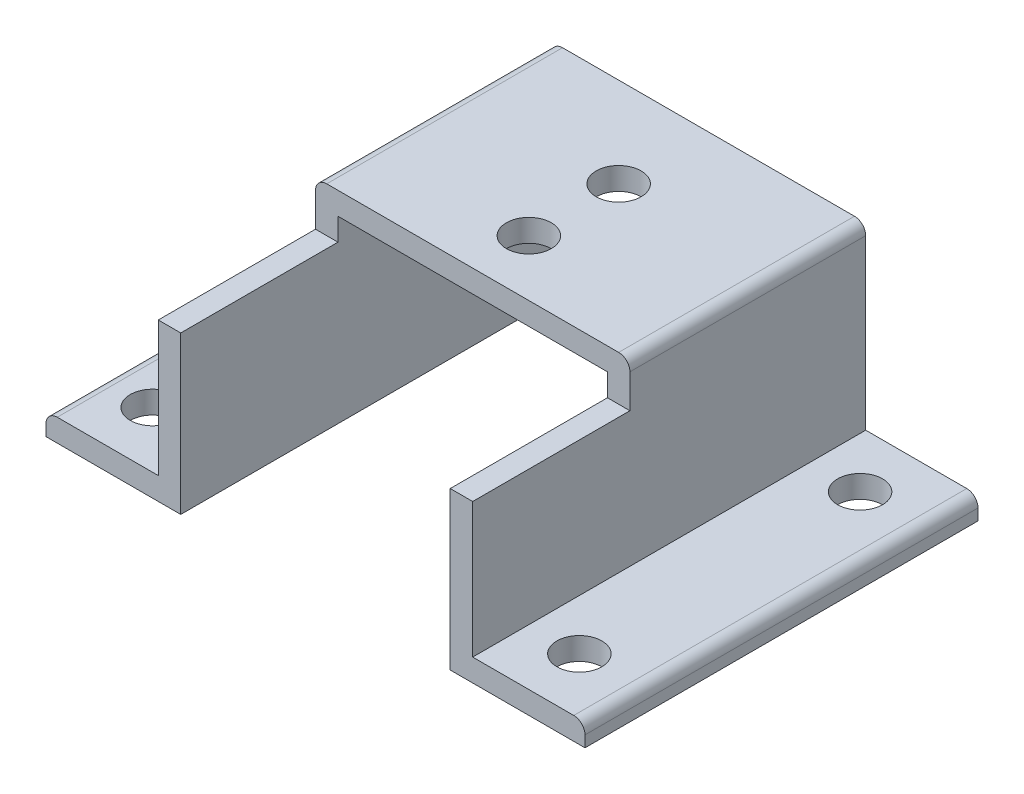
ISO-10303-21;
HEADER;
FILE_DESCRIPTION(('STEP AP214'),'2;1');
FILE_NAME('part.step','',(''),(''),'','','');
FILE_SCHEMA(('AUTOMOTIVE_DESIGN { 1 0 10303 214 1 1 1 1 }'));
ENDSEC;
DATA;
#1=APPLICATION_CONTEXT('core data for automotive mechanical design processes');
#2=APPLICATION_PROTOCOL_DEFINITION('international standard','automotive_design',2000,#1);
#3=PRODUCT_CONTEXT('',#1,'mechanical');
#4=PRODUCT('Part','Part','',(#3));
#5=PRODUCT_RELATED_PRODUCT_CATEGORY('part','',(#4));
#6=PRODUCT_DEFINITION_FORMATION('','',#4);
#7=PRODUCT_DEFINITION_CONTEXT('part definition',#1,'design');
#8=PRODUCT_DEFINITION('design','',#6,#7);
#9=PRODUCT_DEFINITION_SHAPE('','',#8);
#10=(LENGTH_UNIT() NAMED_UNIT(*) SI_UNIT(.MILLI.,.METRE.));
#11=(NAMED_UNIT(*) PLANE_ANGLE_UNIT() SI_UNIT($,.RADIAN.));
#12=(NAMED_UNIT(*) SI_UNIT($,.STERADIAN.) SOLID_ANGLE_UNIT());
#13=UNCERTAINTY_MEASURE_WITH_UNIT(LENGTH_MEASURE(1.E-05),#10,'distance_accuracy_value','');
#14=(GEOMETRIC_REPRESENTATION_CONTEXT(3) GLOBAL_UNCERTAINTY_ASSIGNED_CONTEXT((#13)) GLOBAL_UNIT_ASSIGNED_CONTEXT((#10,
#11,#12)) REPRESENTATION_CONTEXT('',''));
#15=CARTESIAN_POINT('',(0.,0.,0.));
#16=DIRECTION('',(0.,0.,1.));
#17=DIRECTION('',(1.,0.,0.));
#18=AXIS2_PLACEMENT_3D('',#15,#16,#17);
#19=CARTESIAN_POINT('',(0.,0.,35.));
#20=DIRECTION('',(0.,0.,-1.));
#21=DIRECTION('',(-1.,0.,0.));
#22=AXIS2_PLACEMENT_3D('',#19,#20,#21);
#23=PLANE('',#22);
#24=DIRECTION('',(0.,1.,0.));
#25=VECTOR('',#24,1.);
#26=CARTESIAN_POINT('',(48.,2.,35.));
#27=LINE('',#26,#25);
#28=CARTESIAN_POINT('',(48.,0.,35.));
#29=VERTEX_POINT('',#28);
#30=CARTESIAN_POINT('',(48.,1.,35.));
#31=VERTEX_POINT('',#30);
#32=EDGE_CURVE('E224',#29,#31,#27,.T.);
#33=ORIENTED_EDGE('',*,*,#32,.T.);
#34=CARTESIAN_POINT('',(47.,1.,35.));
#35=DIRECTION('',(0.,0.,-1.));
#36=DIRECTION('',(-1.,0.,0.));
#37=AXIS2_PLACEMENT_3D('',#34,#35,#36);
#38=CIRCLE('',#37,1.);
#39=CARTESIAN_POINT('',(47.,2.,35.));
#40=VERTEX_POINT('',#39);
#41=EDGE_CURVE('E324',#31,#40,#38,.F.);
#42=ORIENTED_EDGE('',*,*,#41,.T.);
#43=DIRECTION('',(-1.,0.,0.));
#44=VECTOR('',#43,1.);
#45=CARTESIAN_POINT('',(38.,2.,35.));
#46=LINE('',#45,#44);
#47=CARTESIAN_POINT('',(38.,2.,35.));
#48=VERTEX_POINT('',#47);
#49=EDGE_CURVE('E215',#40,#48,#46,.T.);
#50=ORIENTED_EDGE('',*,*,#49,.T.);
#51=DIRECTION('',(0.,1.,0.));
#52=VECTOR('',#51,1.);
#53=CARTESIAN_POINT('',(38.,18.,35.));
#54=LINE('',#53,#52);
#55=CARTESIAN_POINT('',(38.,14.,35.));
#56=VERTEX_POINT('',#55);
#57=EDGE_CURVE('E207',#48,#56,#54,.T.);
#58=ORIENTED_EDGE('',*,*,#57,.T.);
#59=DIRECTION('',(-1.,0.,0.));
#60=VECTOR('',#59,1.);
#61=CARTESIAN_POINT('',(0.,14.,35.));
#62=LINE('',#61,#60);
#63=CARTESIAN_POINT('',(36.,14.,35.));
#64=VERTEX_POINT('',#63);
#65=EDGE_CURVE('E189',#56,#64,#62,.T.);
#66=ORIENTED_EDGE('',*,*,#65,.T.);
#67=DIRECTION('',(0.,-1.,0.));
#68=VECTOR('',#67,1.);
#69=CARTESIAN_POINT('',(36.,0.,35.));
#70=LINE('',#69,#68);
#71=CARTESIAN_POINT('',(36.,0.,35.));
#72=VERTEX_POINT('',#71);
#73=EDGE_CURVE('E417',#64,#72,#70,.T.);
#74=ORIENTED_EDGE('',*,*,#73,.T.);
#75=DIRECTION('',(1.,0.,0.));
#76=VECTOR('',#75,1.);
#77=CARTESIAN_POINT('',(48.,0.,35.));
#78=LINE('',#77,#76);
#79=EDGE_CURVE('E420',#72,#29,#78,.T.);
#80=ORIENTED_EDGE('',*,*,#79,.T.);
#81=EDGE_LOOP('',(#33,#42,#50,#58,#66,#74,#80));
#82=FACE_BOUND('',#81,.T.);
#83=ADVANCED_FACE('F46',(#82),#23,.F.);
#84=CARTESIAN_POINT('',(12.,0.,35.));
#85=DIRECTION('',(0.,1.,0.));
#86=DIRECTION('',(0.,0.,1.));
#87=AXIS2_PLACEMENT_3D('',#84,#85,#86);
#88=PLANE('',#87);
#89=CARTESIAN_POINT('',(4.5,0.,5.));
#90=DIRECTION('',(0.,1.,0.));
#91=DIRECTION('',(0.,0.,1.));
#92=AXIS2_PLACEMENT_3D('',#89,#90,#91);
#93=CIRCLE('',#92,2.);
#94=CARTESIAN_POINT('',(4.5,0.,7.));
#95=VERTEX_POINT('',#94);
#96=EDGE_CURVE('E857',#95,#95,#93,.T.);
#97=ORIENTED_EDGE('',*,*,#96,.T.);
#98=EDGE_LOOP('',(#97));
#99=FACE_BOUND('',#98,.T.);
#100=CARTESIAN_POINT('',(4.5,0.,30.));
#101=DIRECTION('',(0.,1.,0.));
#102=DIRECTION('',(0.,0.,1.));
#103=AXIS2_PLACEMENT_3D('',#100,#101,#102);
#104=CIRCLE('',#103,2.);
#105=CARTESIAN_POINT('',(4.5,0.,32.));
#106=VERTEX_POINT('',#105);
#107=EDGE_CURVE('E865',#106,#106,#104,.T.);
#108=ORIENTED_EDGE('',*,*,#107,.T.);
#109=EDGE_LOOP('',(#108));
#110=FACE_BOUND('',#109,.T.);
#111=DIRECTION('',(1.,0.,0.));
#112=VECTOR('',#111,1.);
#113=CARTESIAN_POINT('',(12.,0.,0.));
#114=LINE('',#113,#112);
#115=CARTESIAN_POINT('',(0.,0.,0.));
#116=VERTEX_POINT('',#115);
#117=CARTESIAN_POINT('',(12.,0.,0.));
#118=VERTEX_POINT('',#117);
#119=EDGE_CURVE('E235',#116,#118,#114,.T.);
#120=ORIENTED_EDGE('',*,*,#119,.T.);
#121=DIRECTION('',(0.,0.,-1.));
#122=VECTOR('',#121,1.);
#123=CARTESIAN_POINT('',(12.,0.,35.));
#124=LINE('',#123,#122);
#125=CARTESIAN_POINT('',(12.,0.,35.));
#126=VERTEX_POINT('',#125);
#127=EDGE_CURVE('E202',#126,#118,#124,.T.);
#128=ORIENTED_EDGE('',*,*,#127,.F.);
#129=DIRECTION('',(1.,0.,0.));
#130=VECTOR('',#129,1.);
#131=CARTESIAN_POINT('',(12.,0.,35.));
#132=LINE('',#131,#130);
#133=CARTESIAN_POINT('',(0.,0.,35.));
#134=VERTEX_POINT('',#133);
#135=EDGE_CURVE('E278',#134,#126,#132,.T.);
#136=ORIENTED_EDGE('',*,*,#135,.F.);
#137=DIRECTION('',(0.,0.,-1.));
#138=VECTOR('',#137,1.);
#139=CARTESIAN_POINT('',(0.,0.,35.));
#140=LINE('',#139,#138);
#141=EDGE_CURVE('E234',#134,#116,#140,.T.);
#142=ORIENTED_EDGE('',*,*,#141,.T.);
#143=EDGE_LOOP('',(#120,#128,#136,#142));
#144=FACE_BOUND('',#143,.T.);
#145=ADVANCED_FACE('F476',(#99,#110,#144),#88,.F.);
#146=CARTESIAN_POINT('',(12.,16.,35.));
#147=DIRECTION('',(-1.,0.,0.));
#148=DIRECTION('',(0.,0.,1.));
#149=AXIS2_PLACEMENT_3D('',#146,#147,#148);
#150=PLANE('',#149);
#151=DIRECTION('',(0.,0.,-1.));
#152=VECTOR('',#151,1.);
#153=CARTESIAN_POINT('',(12.,16.,35.));
#154=LINE('',#153,#152);
#155=CARTESIAN_POINT('',(12.,16.,21.));
#156=VERTEX_POINT('',#155);
#157=CARTESIAN_POINT('',(12.,16.,0.));
#158=VERTEX_POINT('',#157);
#159=EDGE_CURVE('E300',#156,#158,#154,.T.);
#160=ORIENTED_EDGE('',*,*,#159,.F.);
#161=DIRECTION('',(0.,-1.,0.));
#162=VECTOR('',#161,1.);
#163=CARTESIAN_POINT('',(12.,16.,21.));
#164=LINE('',#163,#162);
#165=CARTESIAN_POINT('',(12.,14.,21.));
#166=VERTEX_POINT('',#165);
#167=EDGE_CURVE('E240',#156,#166,#164,.T.);
#168=ORIENTED_EDGE('',*,*,#167,.T.);
#169=DIRECTION('',(0.,0.,1.));
#170=VECTOR('',#169,1.);
#171=CARTESIAN_POINT('',(12.,14.,35.));
#172=LINE('',#171,#170);
#173=CARTESIAN_POINT('',(12.,14.,35.));
#174=VERTEX_POINT('',#173);
#175=EDGE_CURVE('E395',#166,#174,#172,.T.);
#176=ORIENTED_EDGE('',*,*,#175,.T.);
#177=DIRECTION('',(0.,1.,0.));
#178=VECTOR('',#177,1.);
#179=CARTESIAN_POINT('',(12.,16.,35.));
#180=LINE('',#179,#178);
#181=EDGE_CURVE('E413',#126,#174,#180,.T.);
#182=ORIENTED_EDGE('',*,*,#181,.F.);
#183=ORIENTED_EDGE('',*,*,#127,.T.);
#184=DIRECTION('',(0.,1.,0.));
#185=VECTOR('',#184,1.);
#186=CARTESIAN_POINT('',(12.,16.,0.));
#187=LINE('',#186,#185);
#188=EDGE_CURVE('E239',#118,#158,#187,.T.);
#189=ORIENTED_EDGE('',*,*,#188,.T.);
#190=EDGE_LOOP('',(#160,#168,#176,#182,#183,#189));
#191=FACE_BOUND('',#190,.T.);
#192=ADVANCED_FACE('F481',(#191),#150,.F.);
#193=CARTESIAN_POINT('',(36.,16.,35.));
#194=DIRECTION('',(0.,1.,0.));
#195=DIRECTION('',(0.,0.,1.));
#196=AXIS2_PLACEMENT_3D('',#193,#194,#195);
#197=PLANE('',#196);
#198=CARTESIAN_POINT('',(24.,16.,16.));
#199=DIRECTION('',(0.,1.,0.));
#200=DIRECTION('',(0.,0.,1.));
#201=AXIS2_PLACEMENT_3D('',#198,#199,#200);
#202=CIRCLE('',#201,2.);
#203=CARTESIAN_POINT('',(24.,16.,18.));
#204=VERTEX_POINT('',#203);
#205=EDGE_CURVE('E362',#204,#204,#202,.T.);
#206=ORIENTED_EDGE('',*,*,#205,.T.);
#207=EDGE_LOOP('',(#206));
#208=FACE_BOUND('',#207,.T.);
#209=CARTESIAN_POINT('',(24.,16.,8.));
#210=DIRECTION('',(0.,1.,0.));
#211=DIRECTION('',(0.,0.,1.));
#212=AXIS2_PLACEMENT_3D('',#209,#210,#211);
#213=CIRCLE('',#212,2.);
#214=CARTESIAN_POINT('',(24.,16.,10.));
#215=VERTEX_POINT('',#214);
#216=EDGE_CURVE('E358',#215,#215,#213,.T.);
#217=ORIENTED_EDGE('',*,*,#216,.T.);
#218=EDGE_LOOP('',(#217));
#219=FACE_BOUND('',#218,.T.);
#220=DIRECTION('',(0.,0.,-1.));
#221=VECTOR('',#220,1.);
#222=CARTESIAN_POINT('',(36.,16.,35.));
#223=LINE('',#222,#221);
#224=CARTESIAN_POINT('',(36.,16.,21.));
#225=VERTEX_POINT('',#224);
#226=CARTESIAN_POINT('',(36.,16.,0.));
#227=VERTEX_POINT('',#226);
#228=EDGE_CURVE('E297',#225,#227,#223,.T.);
#229=ORIENTED_EDGE('',*,*,#228,.F.);
#230=DIRECTION('',(-1.,0.,0.));
#231=VECTOR('',#230,1.);
#232=CARTESIAN_POINT('',(36.,16.,21.));
#233=LINE('',#232,#231);
#234=EDGE_CURVE('E403',#225,#156,#233,.T.);
#235=ORIENTED_EDGE('',*,*,#234,.T.);
#236=ORIENTED_EDGE('',*,*,#159,.T.);
#237=DIRECTION('',(1.,0.,0.));
#238=VECTOR('',#237,1.);
#239=CARTESIAN_POINT('',(36.,16.,0.));
#240=LINE('',#239,#238);
#241=EDGE_CURVE('E244',#158,#227,#240,.T.);
#242=ORIENTED_EDGE('',*,*,#241,.T.);
#243=EDGE_LOOP('',(#229,#235,#236,#242));
#244=FACE_BOUND('',#243,.T.);
#245=ADVANCED_FACE('F488',(#208,#219,#244),#197,.F.);
#246=CARTESIAN_POINT('',(36.,0.,35.));
#247=DIRECTION('',(1.,0.,0.));
#248=DIRECTION('',(0.,0.,-1.));
#249=AXIS2_PLACEMENT_3D('',#246,#247,#248);
#250=PLANE('',#249);
#251=DIRECTION('',(0.,0.,-1.));
#252=VECTOR('',#251,1.);
#253=CARTESIAN_POINT('',(36.,14.,35.));
#254=LINE('',#253,#252);
#255=CARTESIAN_POINT('',(36.,14.,21.));
#256=VERTEX_POINT('',#255);
#257=EDGE_CURVE('E196',#64,#256,#254,.T.);
#258=ORIENTED_EDGE('',*,*,#257,.T.);
#259=DIRECTION('',(0.,1.,0.));
#260=VECTOR('',#259,1.);
#261=CARTESIAN_POINT('',(36.,0.,21.));
#262=LINE('',#261,#260);
#263=EDGE_CURVE('E399',#256,#225,#262,.T.);
#264=ORIENTED_EDGE('',*,*,#263,.T.);
#265=ORIENTED_EDGE('',*,*,#228,.T.);
#266=DIRECTION('',(0.,-1.,0.));
#267=VECTOR('',#266,1.);
#268=CARTESIAN_POINT('',(36.,0.,0.));
#269=LINE('',#268,#267);
#270=CARTESIAN_POINT('',(36.,0.,0.));
#271=VERTEX_POINT('',#270);
#272=EDGE_CURVE('E248',#227,#271,#269,.T.);
#273=ORIENTED_EDGE('',*,*,#272,.T.);
#274=DIRECTION('',(0.,0.,-1.));
#275=VECTOR('',#274,1.);
#276=CARTESIAN_POINT('',(36.,0.,35.));
#277=LINE('',#276,#275);
#278=EDGE_CURVE('E293',#72,#271,#277,.T.);
#279=ORIENTED_EDGE('',*,*,#278,.F.);
#280=ORIENTED_EDGE('',*,*,#73,.F.);
#281=EDGE_LOOP('',(#258,#264,#265,#273,#279,#280));
#282=FACE_BOUND('',#281,.T.);
#283=ADVANCED_FACE('F494',(#282),#250,.F.);
#284=CARTESIAN_POINT('',(48.,0.,35.));
#285=DIRECTION('',(0.,1.,0.));
#286=DIRECTION('',(-1.,0.,0.));
#287=AXIS2_PLACEMENT_3D('',#284,#285,#286);
#288=PLANE('',#287);
#289=CARTESIAN_POINT('',(42.5,0.,30.));
#290=DIRECTION('',(0.,1.,0.));
#291=DIRECTION('',(0.,0.,1.));
#292=AXIS2_PLACEMENT_3D('',#289,#290,#291);
#293=CIRCLE('',#292,2.);
#294=CARTESIAN_POINT('',(42.5,0.,32.));
#295=VERTEX_POINT('',#294);
#296=EDGE_CURVE('E853',#295,#295,#293,.T.);
#297=ORIENTED_EDGE('',*,*,#296,.T.);
#298=EDGE_LOOP('',(#297));
#299=FACE_BOUND('',#298,.T.);
#300=CARTESIAN_POINT('',(42.5,0.,5.));
#301=DIRECTION('',(0.,1.,0.));
#302=DIRECTION('',(0.,0.,1.));
#303=AXIS2_PLACEMENT_3D('',#300,#301,#302);
#304=CIRCLE('',#303,2.);
#305=CARTESIAN_POINT('',(42.5,0.,7.));
#306=VERTEX_POINT('',#305);
#307=EDGE_CURVE('E856',#306,#306,#304,.T.);
#308=ORIENTED_EDGE('',*,*,#307,.T.);
#309=EDGE_LOOP('',(#308));
#310=FACE_BOUND('',#309,.T.);
#311=DIRECTION('',(1.,0.,0.));
#312=VECTOR('',#311,1.);
#313=CARTESIAN_POINT('',(48.,0.,0.));
#314=LINE('',#313,#312);
#315=CARTESIAN_POINT('',(48.,0.,0.));
#316=VERTEX_POINT('',#315);
#317=EDGE_CURVE('E251',#271,#316,#314,.T.);
#318=ORIENTED_EDGE('',*,*,#317,.T.);
#319=DIRECTION('',(0.,0.,-1.));
#320=VECTOR('',#319,1.);
#321=CARTESIAN_POINT('',(48.,0.,35.));
#322=LINE('',#321,#320);
#323=EDGE_CURVE('E289',#29,#316,#322,.T.);
#324=ORIENTED_EDGE('',*,*,#323,.F.);
#325=ORIENTED_EDGE('',*,*,#79,.F.);
#326=ORIENTED_EDGE('',*,*,#278,.T.);
#327=EDGE_LOOP('',(#318,#324,#325,#326));
#328=FACE_BOUND('',#327,.T.);
#329=ADVANCED_FACE('F496',(#299,#310,#328),#288,.F.);
#330=CARTESIAN_POINT('',(48.,2.,35.));
#331=DIRECTION('',(-1.,0.,0.));
#332=DIRECTION('',(0.,0.,1.));
#333=AXIS2_PLACEMENT_3D('',#330,#331,#332);
#334=PLANE('',#333);
#335=DIRECTION('',(0.,1.,0.));
#336=VECTOR('',#335,1.);
#337=CARTESIAN_POINT('',(48.,2.,0.));
#338=LINE('',#337,#336);
#339=CARTESIAN_POINT('',(48.,1.,0.));
#340=VERTEX_POINT('',#339);
#341=EDGE_CURVE('E254',#316,#340,#338,.T.);
#342=ORIENTED_EDGE('',*,*,#341,.T.);
#343=DIRECTION('',(0.,0.,-1.));
#344=VECTOR('',#343,1.);
#345=CARTESIAN_POINT('',(48.,1.,35.));
#346=LINE('',#345,#344);
#347=EDGE_CURVE('E321',#340,#31,#346,.F.);
#348=ORIENTED_EDGE('',*,*,#347,.T.);
#349=ORIENTED_EDGE('',*,*,#32,.F.);
#350=ORIENTED_EDGE('',*,*,#323,.T.);
#351=EDGE_LOOP('',(#342,#348,#349,#350));
#352=FACE_BOUND('',#351,.T.);
#353=ADVANCED_FACE('F497',(#352),#334,.F.);
#354=CARTESIAN_POINT('',(38.,2.,35.));
#355=DIRECTION('',(0.,-1.,0.));
#356=DIRECTION('',(1.,0.,0.));
#357=AXIS2_PLACEMENT_3D('',#354,#355,#356);
#358=PLANE('',#357);
#359=CARTESIAN_POINT('',(42.5,2.,30.));
#360=DIRECTION('',(0.,-1.,0.));
#361=DIRECTION('',(1.,0.,0.));
#362=AXIS2_PLACEMENT_3D('',#359,#360,#361);
#363=CIRCLE('',#362,2.);
#364=CARTESIAN_POINT('',(44.5,2.,30.));
#365=VERTEX_POINT('',#364);
#366=EDGE_CURVE('E50',#365,#365,#363,.T.);
#367=ORIENTED_EDGE('',*,*,#366,.T.);
#368=EDGE_LOOP('',(#367));
#369=FACE_BOUND('',#368,.T.);
#370=CARTESIAN_POINT('',(42.5,2.,5.));
#371=DIRECTION('',(0.,-1.,0.));
#372=DIRECTION('',(1.,0.,0.));
#373=AXIS2_PLACEMENT_3D('',#370,#371,#372);
#374=CIRCLE('',#373,2.);
#375=CARTESIAN_POINT('',(44.5,2.,5.));
#376=VERTEX_POINT('',#375);
#377=EDGE_CURVE('E359',#376,#376,#374,.T.);
#378=ORIENTED_EDGE('',*,*,#377,.T.);
#379=EDGE_LOOP('',(#378));
#380=FACE_BOUND('',#379,.T.);
#381=ORIENTED_EDGE('',*,*,#49,.F.);
#382=DIRECTION('',(0.,0.,-1.));
#383=VECTOR('',#382,1.);
#384=CARTESIAN_POINT('',(47.,2.,35.));
#385=LINE('',#384,#383);
#386=CARTESIAN_POINT('',(47.,2.,0.));
#387=VERTEX_POINT('',#386);
#388=EDGE_CURVE('E201',#40,#387,#385,.T.);
#389=ORIENTED_EDGE('',*,*,#388,.T.);
#390=DIRECTION('',(-1.,0.,0.));
#391=VECTOR('',#390,1.);
#392=CARTESIAN_POINT('',(38.,2.,0.));
#393=LINE('',#392,#391);
#394=CARTESIAN_POINT('',(38.,2.,0.));
#395=VERTEX_POINT('',#394);
#396=EDGE_CURVE('E258',#387,#395,#393,.T.);
#397=ORIENTED_EDGE('',*,*,#396,.T.);
#398=DIRECTION('',(0.,0.,-1.));
#399=VECTOR('',#398,1.);
#400=CARTESIAN_POINT('',(38.,2.,35.));
#401=LINE('',#400,#399);
#402=EDGE_CURVE('E286',#48,#395,#401,.T.);
#403=ORIENTED_EDGE('',*,*,#402,.F.);
#404=EDGE_LOOP('',(#381,#389,#397,#403));
#405=FACE_BOUND('',#404,.T.);
#406=ADVANCED_FACE('F434',(#369,#380,#405),#358,.F.);
#407=CARTESIAN_POINT('',(38.,18.,35.));
#408=DIRECTION('',(-1.,0.,0.));
#409=DIRECTION('',(0.,0.,1.));
#410=AXIS2_PLACEMENT_3D('',#407,#408,#409);
#411=PLANE('',#410);
#412=DIRECTION('',(0.,1.,0.));
#413=VECTOR('',#412,1.);
#414=CARTESIAN_POINT('',(38.,18.,0.));
#415=LINE('',#414,#413);
#416=CARTESIAN_POINT('',(38.,17.,0.));
#417=VERTEX_POINT('',#416);
#418=EDGE_CURVE('E261',#395,#417,#415,.T.);
#419=ORIENTED_EDGE('',*,*,#418,.T.);
#420=DIRECTION('',(0.,0.,-1.));
#421=VECTOR('',#420,1.);
#422=CARTESIAN_POINT('',(38.,17.,35.));
#423=LINE('',#422,#421);
#424=CARTESIAN_POINT('',(38.,17.,21.));
#425=VERTEX_POINT('',#424);
#426=EDGE_CURVE('E72',#417,#425,#423,.F.);
#427=ORIENTED_EDGE('',*,*,#426,.T.);
#428=DIRECTION('',(0.,1.,0.));
#429=VECTOR('',#428,1.);
#430=CARTESIAN_POINT('',(38.,14.,21.));
#431=LINE('',#430,#429);
#432=CARTESIAN_POINT('',(38.,14.,21.));
#433=VERTEX_POINT('',#432);
#434=EDGE_CURVE('E208',#433,#425,#431,.T.);
#435=ORIENTED_EDGE('',*,*,#434,.F.);
#436=DIRECTION('',(0.,0.,-1.));
#437=VECTOR('',#436,1.);
#438=CARTESIAN_POINT('',(38.,14.,35.));
#439=LINE('',#438,#437);
#440=EDGE_CURVE('E193',#56,#433,#439,.T.);
#441=ORIENTED_EDGE('',*,*,#440,.F.);
#442=ORIENTED_EDGE('',*,*,#57,.F.);
#443=ORIENTED_EDGE('',*,*,#402,.T.);
#444=EDGE_LOOP('',(#419,#427,#435,#441,#442,#443));
#445=FACE_BOUND('',#444,.T.);
#446=ADVANCED_FACE('F205',(#445),#411,.F.);
#447=CARTESIAN_POINT('',(10.,18.,35.));
#448=DIRECTION('',(0.,-1.,0.));
#449=DIRECTION('',(0.,0.,-1.));
#450=AXIS2_PLACEMENT_3D('',#447,#448,#449);
#451=PLANE('',#450);
#452=CARTESIAN_POINT('',(24.,18.,16.));
#453=DIRECTION('',(0.,1.,0.));
#454=DIRECTION('',(0.,0.,1.));
#455=AXIS2_PLACEMENT_3D('',#452,#453,#454);
#456=CIRCLE('',#455,2.);
#457=CARTESIAN_POINT('',(24.,18.,18.));
#458=VERTEX_POINT('',#457);
#459=EDGE_CURVE('E862',#458,#458,#456,.T.);
#460=ORIENTED_EDGE('',*,*,#459,.F.);
#461=EDGE_LOOP('',(#460));
#462=FACE_BOUND('',#461,.T.);
#463=CARTESIAN_POINT('',(24.,18.,8.));
#464=DIRECTION('',(0.,1.,0.));
#465=DIRECTION('',(0.,0.,1.));
#466=AXIS2_PLACEMENT_3D('',#463,#464,#465);
#467=CIRCLE('',#466,2.);
#468=CARTESIAN_POINT('',(24.,18.,10.));
#469=VERTEX_POINT('',#468);
#470=EDGE_CURVE('E355',#469,#469,#467,.T.);
#471=ORIENTED_EDGE('',*,*,#470,.F.);
#472=EDGE_LOOP('',(#471));
#473=FACE_BOUND('',#472,.T.);
#474=DIRECTION('',(-1.,0.,0.));
#475=VECTOR('',#474,1.);
#476=CARTESIAN_POINT('',(10.,18.,21.));
#477=LINE('',#476,#475);
#478=CARTESIAN_POINT('',(37.,18.,21.));
#479=VERTEX_POINT('',#478);
#480=CARTESIAN_POINT('',(11.,18.,21.));
#481=VERTEX_POINT('',#480);
#482=EDGE_CURVE('E368',#479,#481,#477,.T.);
#483=ORIENTED_EDGE('',*,*,#482,.F.);
#484=DIRECTION('',(0.,0.,-1.));
#485=VECTOR('',#484,1.);
#486=CARTESIAN_POINT('',(37.,18.,35.));
#487=LINE('',#486,#485);
#488=CARTESIAN_POINT('',(37.,18.,0.));
#489=VERTEX_POINT('',#488);
#490=EDGE_CURVE('E340',#479,#489,#487,.T.);
#491=ORIENTED_EDGE('',*,*,#490,.T.);
#492=DIRECTION('',(-1.,0.,0.));
#493=VECTOR('',#492,1.);
#494=CARTESIAN_POINT('',(10.,18.,0.));
#495=LINE('',#494,#493);
#496=CARTESIAN_POINT('',(11.,18.,0.));
#497=VERTEX_POINT('',#496);
#498=EDGE_CURVE('E264',#489,#497,#495,.T.);
#499=ORIENTED_EDGE('',*,*,#498,.T.);
#500=DIRECTION('',(0.,0.,-1.));
#501=VECTOR('',#500,1.);
#502=CARTESIAN_POINT('',(11.,18.,35.));
#503=LINE('',#502,#501);
#504=EDGE_CURVE('E337',#497,#481,#503,.F.);
#505=ORIENTED_EDGE('',*,*,#504,.T.);
#506=EDGE_LOOP('',(#483,#491,#499,#505));
#507=FACE_BOUND('',#506,.T.);
#508=ADVANCED_FACE('F447',(#462,#473,#507),#451,.F.);
#509=CARTESIAN_POINT('',(10.,2.,35.));
#510=DIRECTION('',(1.,0.,0.));
#511=DIRECTION('',(0.,0.,-1.));
#512=AXIS2_PLACEMENT_3D('',#509,#510,#511);
#513=PLANE('',#512);
#514=DIRECTION('',(0.,1.,0.));
#515=VECTOR('',#514,1.);
#516=CARTESIAN_POINT('',(10.,14.,21.));
#517=LINE('',#516,#515);
#518=CARTESIAN_POINT('',(10.,14.,21.));
#519=VERTEX_POINT('',#518);
#520=CARTESIAN_POINT('',(10.,17.,21.));
#521=VERTEX_POINT('',#520);
#522=EDGE_CURVE('E388',#519,#521,#517,.T.);
#523=ORIENTED_EDGE('',*,*,#522,.T.);
#524=DIRECTION('',(0.,0.,-1.));
#525=VECTOR('',#524,1.);
#526=CARTESIAN_POINT('',(10.,17.,35.));
#527=LINE('',#526,#525);
#528=CARTESIAN_POINT('',(10.,17.,0.));
#529=VERTEX_POINT('',#528);
#530=EDGE_CURVE('E11',#521,#529,#527,.T.);
#531=ORIENTED_EDGE('',*,*,#530,.T.);
#532=DIRECTION('',(0.,-1.,0.));
#533=VECTOR('',#532,1.);
#534=CARTESIAN_POINT('',(10.,2.,0.));
#535=LINE('',#534,#533);
#536=CARTESIAN_POINT('',(10.,2.,0.));
#537=VERTEX_POINT('',#536);
#538=EDGE_CURVE('E268',#529,#537,#535,.T.);
#539=ORIENTED_EDGE('',*,*,#538,.T.);
#540=DIRECTION('',(0.,0.,-1.));
#541=VECTOR('',#540,1.);
#542=CARTESIAN_POINT('',(10.,2.,35.));
#543=LINE('',#542,#541);
#544=CARTESIAN_POINT('',(10.,2.,35.));
#545=VERTEX_POINT('',#544);
#546=EDGE_CURVE('E282',#545,#537,#543,.T.);
#547=ORIENTED_EDGE('',*,*,#546,.F.);
#548=DIRECTION('',(0.,-1.,0.));
#549=VECTOR('',#548,1.);
#550=CARTESIAN_POINT('',(10.,2.,35.));
#551=LINE('',#550,#549);
#552=CARTESIAN_POINT('',(10.,14.,35.));
#553=VERTEX_POINT('',#552);
#554=EDGE_CURVE('E218',#553,#545,#551,.T.);
#555=ORIENTED_EDGE('',*,*,#554,.F.);
#556=DIRECTION('',(0.,0.,1.));
#557=VECTOR('',#556,1.);
#558=CARTESIAN_POINT('',(10.,14.,35.));
#559=LINE('',#558,#557);
#560=EDGE_CURVE('E378',#519,#553,#559,.T.);
#561=ORIENTED_EDGE('',*,*,#560,.F.);
#562=EDGE_LOOP('',(#523,#531,#539,#547,#555,#561));
#563=FACE_BOUND('',#562,.T.);
#564=ADVANCED_FACE('F453',(#563),#513,.F.);
#565=CARTESIAN_POINT('',(0.,2.,35.));
#566=DIRECTION('',(0.,-1.,0.));
#567=DIRECTION('',(1.,0.,0.));
#568=AXIS2_PLACEMENT_3D('',#565,#566,#567);
#569=PLANE('',#568);
#570=CARTESIAN_POINT('',(4.5,2.,5.));
#571=DIRECTION('',(0.,-1.,0.));
#572=DIRECTION('',(1.,0.,0.));
#573=AXIS2_PLACEMENT_3D('',#570,#571,#572);
#574=CIRCLE('',#573,2.);
#575=CARTESIAN_POINT('',(6.5,2.,5.));
#576=VERTEX_POINT('',#575);
#577=EDGE_CURVE('E354',#576,#576,#574,.T.);
#578=ORIENTED_EDGE('',*,*,#577,.T.);
#579=EDGE_LOOP('',(#578));
#580=FACE_BOUND('',#579,.T.);
#581=CARTESIAN_POINT('',(4.5,2.,30.));
#582=DIRECTION('',(0.,-1.,0.));
#583=DIRECTION('',(1.,0.,0.));
#584=AXIS2_PLACEMENT_3D('',#581,#582,#583);
#585=CIRCLE('',#584,2.);
#586=CARTESIAN_POINT('',(6.5,2.,30.));
#587=VERTEX_POINT('',#586);
#588=EDGE_CURVE('E350',#587,#587,#585,.T.);
#589=ORIENTED_EDGE('',*,*,#588,.T.);
#590=EDGE_LOOP('',(#589));
#591=FACE_BOUND('',#590,.T.);
#592=DIRECTION('',(-1.,0.,0.));
#593=VECTOR('',#592,1.);
#594=CARTESIAN_POINT('',(0.,2.,0.));
#595=LINE('',#594,#593);
#596=CARTESIAN_POINT('',(1.,2.,0.));
#597=VERTEX_POINT('',#596);
#598=EDGE_CURVE('E271',#537,#597,#595,.T.);
#599=ORIENTED_EDGE('',*,*,#598,.T.);
#600=DIRECTION('',(0.,0.,-1.));
#601=VECTOR('',#600,1.);
#602=CARTESIAN_POINT('',(1.,2.,35.));
#603=LINE('',#602,#601);
#604=CARTESIAN_POINT('',(1.,2.,35.));
#605=VERTEX_POINT('',#604);
#606=EDGE_CURVE('E331',#597,#605,#603,.F.);
#607=ORIENTED_EDGE('',*,*,#606,.T.);
#608=DIRECTION('',(-1.,0.,0.));
#609=VECTOR('',#608,1.);
#610=CARTESIAN_POINT('',(0.,2.,35.));
#611=LINE('',#610,#609);
#612=EDGE_CURVE('E222',#545,#605,#611,.T.);
#613=ORIENTED_EDGE('',*,*,#612,.F.);
#614=ORIENTED_EDGE('',*,*,#546,.T.);
#615=EDGE_LOOP('',(#599,#607,#613,#614));
#616=FACE_BOUND('',#615,.T.);
#617=ADVANCED_FACE('F460',(#580,#591,#616),#569,.F.);
#618=CARTESIAN_POINT('',(0.,0.,35.));
#619=DIRECTION('',(1.,0.,0.));
#620=DIRECTION('',(0.,0.,-1.));
#621=AXIS2_PLACEMENT_3D('',#618,#619,#620);
#622=PLANE('',#621);
#623=DIRECTION('',(0.,-1.,0.));
#624=VECTOR('',#623,1.);
#625=CARTESIAN_POINT('',(0.,0.,35.));
#626=LINE('',#625,#624);
#627=CARTESIAN_POINT('',(0.,1.,35.));
#628=VERTEX_POINT('',#627);
#629=EDGE_CURVE('E231',#628,#134,#626,.T.);
#630=ORIENTED_EDGE('',*,*,#629,.F.);
#631=DIRECTION('',(0.,0.,-1.));
#632=VECTOR('',#631,1.);
#633=CARTESIAN_POINT('',(0.,1.,35.));
#634=LINE('',#633,#632);
#635=CARTESIAN_POINT('',(0.,1.,0.));
#636=VERTEX_POINT('',#635);
#637=EDGE_CURVE('E327',#628,#636,#634,.T.);
#638=ORIENTED_EDGE('',*,*,#637,.T.);
#639=DIRECTION('',(0.,-1.,0.));
#640=VECTOR('',#639,1.);
#641=CARTESIAN_POINT('',(0.,0.,0.));
#642=LINE('',#641,#640);
#643=EDGE_CURVE('E275',#636,#116,#642,.T.);
#644=ORIENTED_EDGE('',*,*,#643,.T.);
#645=ORIENTED_EDGE('',*,*,#141,.F.);
#646=EDGE_LOOP('',(#630,#638,#644,#645));
#647=FACE_BOUND('',#646,.T.);
#648=ADVANCED_FACE('F471',(#647),#622,.F.);
#649=ORIENTED_EDGE('',*,*,#612,.T.);
#650=CARTESIAN_POINT('',(1.,1.,35.));
#651=DIRECTION('',(0.,0.,-1.));
#652=DIRECTION('',(-1.,0.,0.));
#653=AXIS2_PLACEMENT_3D('',#650,#651,#652);
#654=CIRCLE('',#653,1.);
#655=EDGE_CURVE('E334',#605,#628,#654,.F.);
#656=ORIENTED_EDGE('',*,*,#655,.T.);
#657=ORIENTED_EDGE('',*,*,#629,.T.);
#658=ORIENTED_EDGE('',*,*,#135,.T.);
#659=ORIENTED_EDGE('',*,*,#181,.T.);
#660=DIRECTION('',(1.,0.,0.));
#661=VECTOR('',#660,1.);
#662=CARTESIAN_POINT('',(10.,14.,35.));
#663=LINE('',#662,#661);
#664=EDGE_CURVE('E211',#553,#174,#663,.T.);
#665=ORIENTED_EDGE('',*,*,#664,.F.);
#666=ORIENTED_EDGE('',*,*,#554,.T.);
#667=EDGE_LOOP('',(#649,#656,#657,#658,#659,#665,#666));
#668=FACE_BOUND('',#667,.T.);
#669=ADVANCED_FACE('F468',(#668),#23,.F.);
#670=CARTESIAN_POINT('',(0.,0.,0.));
#671=DIRECTION('',(0.,0.,-1.));
#672=DIRECTION('',(-1.,0.,0.));
#673=AXIS2_PLACEMENT_3D('',#670,#671,#672);
#674=PLANE('',#673);
#675=ORIENTED_EDGE('',*,*,#396,.F.);
#676=CARTESIAN_POINT('',(47.,1.,0.));
#677=DIRECTION('',(0.,0.,-1.));
#678=DIRECTION('',(-1.,0.,0.));
#679=AXIS2_PLACEMENT_3D('',#676,#677,#678);
#680=CIRCLE('',#679,1.);
#681=EDGE_CURVE('E318',#387,#340,#680,.T.);
#682=ORIENTED_EDGE('',*,*,#681,.T.);
#683=ORIENTED_EDGE('',*,*,#341,.F.);
#684=ORIENTED_EDGE('',*,*,#317,.F.);
#685=ORIENTED_EDGE('',*,*,#272,.F.);
#686=ORIENTED_EDGE('',*,*,#241,.F.);
#687=ORIENTED_EDGE('',*,*,#188,.F.);
#688=ORIENTED_EDGE('',*,*,#119,.F.);
#689=ORIENTED_EDGE('',*,*,#643,.F.);
#690=CARTESIAN_POINT('',(1.,1.,0.));
#691=DIRECTION('',(0.,0.,-1.));
#692=DIRECTION('',(-1.,0.,0.));
#693=AXIS2_PLACEMENT_3D('',#690,#691,#692);
#694=CIRCLE('',#693,1.);
#695=EDGE_CURVE('E315',#636,#597,#694,.T.);
#696=ORIENTED_EDGE('',*,*,#695,.T.);
#697=ORIENTED_EDGE('',*,*,#598,.F.);
#698=ORIENTED_EDGE('',*,*,#538,.F.);
#699=CARTESIAN_POINT('',(11.,17.,0.));
#700=DIRECTION('',(0.,0.,-1.));
#701=DIRECTION('',(-1.,0.,0.));
#702=AXIS2_PLACEMENT_3D('',#699,#700,#701);
#703=CIRCLE('',#702,1.);
#704=EDGE_CURVE('E309',#529,#497,#703,.T.);
#705=ORIENTED_EDGE('',*,*,#704,.T.);
#706=ORIENTED_EDGE('',*,*,#498,.F.);
#707=CARTESIAN_POINT('',(37.,17.,0.));
#708=DIRECTION('',(0.,0.,-1.));
#709=DIRECTION('',(-1.,0.,0.));
#710=AXIS2_PLACEMENT_3D('',#707,#708,#709);
#711=CIRCLE('',#710,1.);
#712=EDGE_CURVE('E312',#489,#417,#711,.T.);
#713=ORIENTED_EDGE('',*,*,#712,.T.);
#714=ORIENTED_EDGE('',*,*,#418,.F.);
#715=EDGE_LOOP('',(#675,#682,#683,#684,#685,#686,#687,#688,#689,#696,#697,#698,#705,#706,#713,#714));
#716=FACE_BOUND('',#715,.T.);
#717=ADVANCED_FACE('F437',(#716),#674,.T.);
#718=CARTESIAN_POINT('',(10.,14.,21.));
#719=DIRECTION('',(0.,0.,-1.));
#720=DIRECTION('',(-1.,0.,0.));
#721=AXIS2_PLACEMENT_3D('',#718,#719,#720);
#722=PLANE('',#721);
#723=ORIENTED_EDGE('',*,*,#434,.T.);
#724=CARTESIAN_POINT('',(37.,17.,21.));
#725=DIRECTION('',(0.,0.,-1.));
#726=DIRECTION('',(-1.,0.,0.));
#727=AXIS2_PLACEMENT_3D('',#724,#725,#726);
#728=CIRCLE('',#727,1.);
#729=EDGE_CURVE('E56',#425,#479,#728,.F.);
#730=ORIENTED_EDGE('',*,*,#729,.T.);
#731=ORIENTED_EDGE('',*,*,#482,.T.);
#732=CARTESIAN_POINT('',(11.,17.,21.));
#733=DIRECTION('',(0.,0.,-1.));
#734=DIRECTION('',(-1.,0.,0.));
#735=AXIS2_PLACEMENT_3D('',#732,#733,#734);
#736=CIRCLE('',#735,1.);
#737=EDGE_CURVE('E64',#481,#521,#736,.F.);
#738=ORIENTED_EDGE('',*,*,#737,.T.);
#739=ORIENTED_EDGE('',*,*,#522,.F.);
#740=DIRECTION('',(-1.,0.,0.));
#741=VECTOR('',#740,1.);
#742=CARTESIAN_POINT('',(10.,14.,21.));
#743=LINE('',#742,#741);
#744=EDGE_CURVE('E210',#166,#519,#743,.T.);
#745=ORIENTED_EDGE('',*,*,#744,.F.);
#746=ORIENTED_EDGE('',*,*,#167,.F.);
#747=ORIENTED_EDGE('',*,*,#234,.F.);
#748=ORIENTED_EDGE('',*,*,#263,.F.);
#749=EDGE_CURVE('E383',#433,#256,#743,.T.);
#750=ORIENTED_EDGE('',*,*,#749,.F.);
#751=EDGE_LOOP('',(#723,#730,#731,#738,#739,#745,#746,#747,#748,#750));
#752=FACE_BOUND('',#751,.T.);
#753=ADVANCED_FACE('F445',(#752),#722,.F.);
#754=CARTESIAN_POINT('',(0.,14.,0.));
#755=DIRECTION('',(0.,-1.,0.));
#756=DIRECTION('',(0.,0.,-1.));
#757=AXIS2_PLACEMENT_3D('',#754,#755,#756);
#758=PLANE('',#757);
#759=ORIENTED_EDGE('',*,*,#744,.T.);
#760=ORIENTED_EDGE('',*,*,#560,.T.);
#761=ORIENTED_EDGE('',*,*,#664,.T.);
#762=ORIENTED_EDGE('',*,*,#175,.F.);
#763=EDGE_LOOP('',(#759,#760,#761,#762));
#764=FACE_BOUND('',#763,.T.);
#765=ADVANCED_FACE('F484',(#764),#758,.F.);
#766=ORIENTED_EDGE('',*,*,#65,.F.);
#767=ORIENTED_EDGE('',*,*,#440,.T.);
#768=ORIENTED_EDGE('',*,*,#749,.T.);
#769=ORIENTED_EDGE('',*,*,#257,.F.);
#770=EDGE_LOOP('',(#766,#767,#768,#769));
#771=FACE_BOUND('',#770,.T.);
#772=ADVANCED_FACE('F191',(#771),#758,.F.);
#773=CARTESIAN_POINT('',(47.,1.,35.));
#774=DIRECTION('',(0.,0.,-1.));
#775=DIRECTION('',(-1.,0.,0.));
#776=AXIS2_PLACEMENT_3D('',#773,#774,#775);
#777=CYLINDRICAL_SURFACE('',#776,1.);
#778=ORIENTED_EDGE('',*,*,#41,.F.);
#779=ORIENTED_EDGE('',*,*,#347,.F.);
#780=ORIENTED_EDGE('',*,*,#681,.F.);
#781=ORIENTED_EDGE('',*,*,#388,.F.);
#782=EDGE_LOOP('',(#778,#779,#780,#781));
#783=FACE_BOUND('',#782,.T.);
#784=ADVANCED_FACE('F431',(#783),#777,.T.);
#785=CARTESIAN_POINT('',(1.,1.,35.));
#786=DIRECTION('',(0.,0.,-1.));
#787=DIRECTION('',(-1.,0.,0.));
#788=AXIS2_PLACEMENT_3D('',#785,#786,#787);
#789=CYLINDRICAL_SURFACE('',#788,1.);
#790=ORIENTED_EDGE('',*,*,#655,.F.);
#791=ORIENTED_EDGE('',*,*,#606,.F.);
#792=ORIENTED_EDGE('',*,*,#695,.F.);
#793=ORIENTED_EDGE('',*,*,#637,.F.);
#794=EDGE_LOOP('',(#790,#791,#792,#793));
#795=FACE_BOUND('',#794,.T.);
#796=ADVANCED_FACE('F464',(#795),#789,.T.);
#797=CARTESIAN_POINT('',(37.,17.,35.));
#798=DIRECTION('',(0.,0.,-1.));
#799=DIRECTION('',(-1.,0.,0.));
#800=AXIS2_PLACEMENT_3D('',#797,#798,#799);
#801=CYLINDRICAL_SURFACE('',#800,1.);
#802=ORIENTED_EDGE('',*,*,#729,.F.);
#803=ORIENTED_EDGE('',*,*,#426,.F.);
#804=ORIENTED_EDGE('',*,*,#712,.F.);
#805=ORIENTED_EDGE('',*,*,#490,.F.);
#806=EDGE_LOOP('',(#802,#803,#804,#805));
#807=FACE_BOUND('',#806,.T.);
#808=ADVANCED_FACE('F442',(#807),#801,.T.);
#809=CARTESIAN_POINT('',(11.,17.,35.));
#810=DIRECTION('',(0.,0.,-1.));
#811=DIRECTION('',(-1.,0.,0.));
#812=AXIS2_PLACEMENT_3D('',#809,#810,#811);
#813=CYLINDRICAL_SURFACE('',#812,1.);
#814=ORIENTED_EDGE('',*,*,#737,.F.);
#815=ORIENTED_EDGE('',*,*,#504,.F.);
#816=ORIENTED_EDGE('',*,*,#704,.F.);
#817=ORIENTED_EDGE('',*,*,#530,.F.);
#818=EDGE_LOOP('',(#814,#815,#816,#817));
#819=FACE_BOUND('',#818,.T.);
#820=ADVANCED_FACE('F48',(#819),#813,.T.);
#821=CARTESIAN_POINT('',(4.5,0.,30.));
#822=DIRECTION('',(0.,1.,0.));
#823=DIRECTION('',(0.,0.,1.));
#824=AXIS2_PLACEMENT_3D('',#821,#822,#823);
#825=CYLINDRICAL_SURFACE('',#824,2.);
#826=ORIENTED_EDGE('',*,*,#107,.F.);
#827=EDGE_LOOP('',(#826));
#828=FACE_BOUND('',#827,.T.);
#829=ORIENTED_EDGE('',*,*,#588,.F.);
#830=EDGE_LOOP('',(#829));
#831=FACE_BOUND('',#830,.T.);
#832=ADVANCED_FACE('F622',(#828,#831),#825,.F.);
#833=CARTESIAN_POINT('',(4.5,0.,5.));
#834=DIRECTION('',(0.,1.,0.));
#835=DIRECTION('',(0.,0.,1.));
#836=AXIS2_PLACEMENT_3D('',#833,#834,#835);
#837=CYLINDRICAL_SURFACE('',#836,2.);
#838=ORIENTED_EDGE('',*,*,#96,.F.);
#839=EDGE_LOOP('',(#838));
#840=FACE_BOUND('',#839,.T.);
#841=ORIENTED_EDGE('',*,*,#577,.F.);
#842=EDGE_LOOP('',(#841));
#843=FACE_BOUND('',#842,.T.);
#844=ADVANCED_FACE('F630',(#840,#843),#837,.F.);
#845=CARTESIAN_POINT('',(24.,0.,8.));
#846=DIRECTION('',(0.,1.,0.));
#847=DIRECTION('',(0.,0.,1.));
#848=AXIS2_PLACEMENT_3D('',#845,#846,#847);
#849=CYLINDRICAL_SURFACE('',#848,2.);
#850=ORIENTED_EDGE('',*,*,#470,.T.);
#851=EDGE_LOOP('',(#850));
#852=FACE_BOUND('',#851,.T.);
#853=ORIENTED_EDGE('',*,*,#216,.F.);
#854=EDGE_LOOP('',(#853));
#855=FACE_BOUND('',#854,.T.);
#856=ADVANCED_FACE('F640',(#852,#855),#849,.F.);
#857=CARTESIAN_POINT('',(24.,0.,16.));
#858=DIRECTION('',(0.,1.,0.));
#859=DIRECTION('',(0.,0.,1.));
#860=AXIS2_PLACEMENT_3D('',#857,#858,#859);
#861=CYLINDRICAL_SURFACE('',#860,2.);
#862=ORIENTED_EDGE('',*,*,#459,.T.);
#863=EDGE_LOOP('',(#862));
#864=FACE_BOUND('',#863,.T.);
#865=ORIENTED_EDGE('',*,*,#205,.F.);
#866=EDGE_LOOP('',(#865));
#867=FACE_BOUND('',#866,.T.);
#868=ADVANCED_FACE('F650',(#864,#867),#861,.F.);
#869=CARTESIAN_POINT('',(42.5,0.,5.));
#870=DIRECTION('',(0.,1.,0.));
#871=DIRECTION('',(0.,0.,1.));
#872=AXIS2_PLACEMENT_3D('',#869,#870,#871);
#873=CYLINDRICAL_SURFACE('',#872,2.);
#874=ORIENTED_EDGE('',*,*,#307,.F.);
#875=EDGE_LOOP('',(#874));
#876=FACE_BOUND('',#875,.T.);
#877=ORIENTED_EDGE('',*,*,#377,.F.);
#878=EDGE_LOOP('',(#877));
#879=FACE_BOUND('',#878,.T.);
#880=ADVANCED_FACE('F660',(#876,#879),#873,.F.);
#881=CARTESIAN_POINT('',(42.5,0.,30.));
#882=DIRECTION('',(0.,1.,0.));
#883=DIRECTION('',(0.,0.,1.));
#884=AXIS2_PLACEMENT_3D('',#881,#882,#883);
#885=CYLINDRICAL_SURFACE('',#884,2.);
#886=ORIENTED_EDGE('',*,*,#296,.F.);
#887=EDGE_LOOP('',(#886));
#888=FACE_BOUND('',#887,.T.);
#889=ORIENTED_EDGE('',*,*,#366,.F.);
#890=EDGE_LOOP('',(#889));
#891=FACE_BOUND('',#890,.T.);
#892=ADVANCED_FACE('F670',(#888,#891),#885,.F.);
#893=CLOSED_SHELL('',(#83,#145,#192,#245,#283,#329,#353,#406,#446,#508,#564,#617,#648,#669,#717,
#753,#765,#772,#784,#796,#808,#820,#832,#844,#856,#868,#880,#892));
#894=MANIFOLD_SOLID_BREP('B2',#893);
#895=ADVANCED_BREP_SHAPE_REPRESENTATION('',(#18,#894),#14);
#896=SHAPE_DEFINITION_REPRESENTATION(#9,#895);
ENDSEC;
END-ISO-10303-21;
